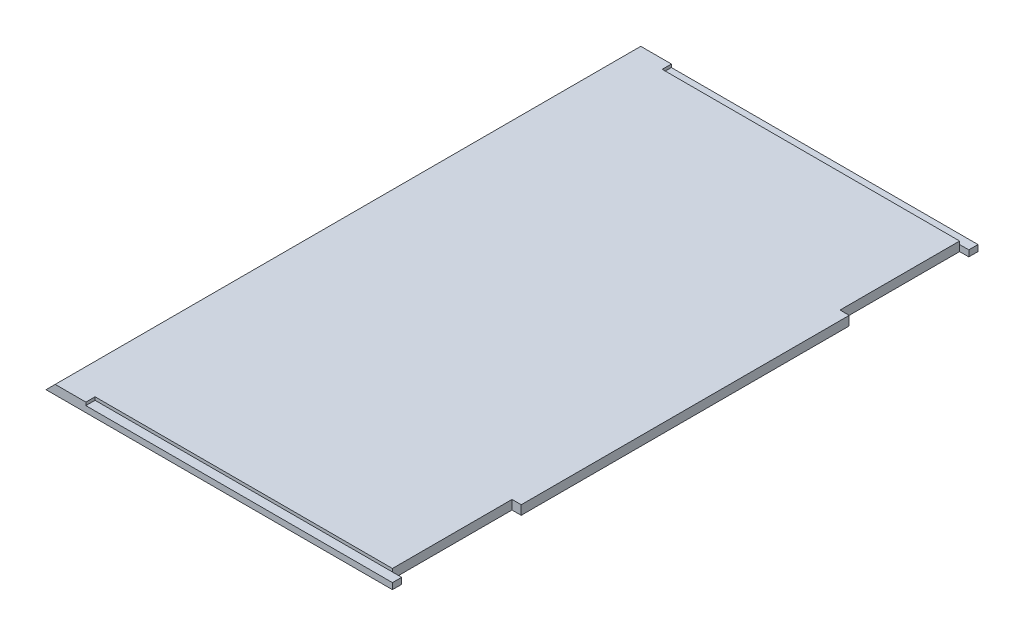
ISO-10303-21;
HEADER;
FILE_DESCRIPTION(('STEP AP214'),'2;1');
FILE_NAME('part.step','',(''),(''),'','','');
FILE_SCHEMA(('AUTOMOTIVE_DESIGN { 1 0 10303 214 1 1 1 1 }'));
ENDSEC;
DATA;
#1=APPLICATION_CONTEXT('core data for automotive mechanical design processes');
#2=APPLICATION_PROTOCOL_DEFINITION('international standard','automotive_design',2000,#1);
#3=PRODUCT_CONTEXT('',#1,'mechanical');
#4=PRODUCT('Part','Part','',(#3));
#5=PRODUCT_RELATED_PRODUCT_CATEGORY('part','',(#4));
#6=PRODUCT_DEFINITION_FORMATION('','',#4);
#7=PRODUCT_DEFINITION_CONTEXT('part definition',#1,'design');
#8=PRODUCT_DEFINITION('design','',#6,#7);
#9=PRODUCT_DEFINITION_SHAPE('','',#8);
#10=(LENGTH_UNIT() NAMED_UNIT(*) SI_UNIT(.MILLI.,.METRE.));
#11=(NAMED_UNIT(*) PLANE_ANGLE_UNIT() SI_UNIT($,.RADIAN.));
#12=(NAMED_UNIT(*) SI_UNIT($,.STERADIAN.) SOLID_ANGLE_UNIT());
#13=UNCERTAINTY_MEASURE_WITH_UNIT(LENGTH_MEASURE(1.E-05),#10,'distance_accuracy_value','');
#14=(GEOMETRIC_REPRESENTATION_CONTEXT(3) GLOBAL_UNCERTAINTY_ASSIGNED_CONTEXT((#13)) GLOBAL_UNIT_ASSIGNED_CONTEXT((#10,
#11,#12)) REPRESENTATION_CONTEXT('',''));
#15=CARTESIAN_POINT('',(0.,0.,0.));
#16=DIRECTION('',(0.,0.,1.));
#17=DIRECTION('',(1.,0.,0.));
#18=AXIS2_PLACEMENT_3D('',#15,#16,#17);
#19=CARTESIAN_POINT('',(75.4824524407195,3.,-10.5327159198509));
#20=DIRECTION('',(-1.,0.,0.));
#21=DIRECTION('',(0.,0.,1.));
#22=AXIS2_PLACEMENT_3D('',#19,#20,#21);
#23=PLANE('',#22);
#24=DIRECTION('',(0.,-1.,0.));
#25=VECTOR('',#24,1.);
#26=CARTESIAN_POINT('',(75.4824524407195,3.,177.467284080149));
#27=LINE('',#26,#25);
#28=CARTESIAN_POINT('',(75.4824524407195,2.,177.467284080149));
#29=VERTEX_POINT('',#28);
#30=CARTESIAN_POINT('',(75.4824524407195,0.,177.467284080149));
#31=VERTEX_POINT('',#30);
#32=EDGE_CURVE('E295',#29,#31,#27,.T.);
#33=ORIENTED_EDGE('',*,*,#32,.F.);
#34=DIRECTION('',(0.,0.,-1.));
#35=VECTOR('',#34,1.);
#36=CARTESIAN_POINT('',(75.4824524407195,2.,177.467284080149));
#37=LINE('',#36,#35);
#38=CARTESIAN_POINT('',(75.4824524407195,2.,180.467284080149));
#39=VERTEX_POINT('',#38);
#40=EDGE_CURVE('E247',#39,#29,#37,.T.);
#41=ORIENTED_EDGE('',*,*,#40,.F.);
#42=DIRECTION('',(0.,-1.,0.));
#43=VECTOR('',#42,1.);
#44=CARTESIAN_POINT('',(75.4824524407195,3.,180.467284080149));
#45=LINE('',#44,#43);
#46=CARTESIAN_POINT('',(75.4824524407195,0.,180.467284080149));
#47=VERTEX_POINT('',#46);
#48=EDGE_CURVE('E213',#39,#47,#45,.T.);
#49=ORIENTED_EDGE('',*,*,#48,.T.);
#50=DIRECTION('',(0.,0.,-1.));
#51=VECTOR('',#50,1.);
#52=CARTESIAN_POINT('',(75.4824524407195,0.,-10.5327159198509));
#53=LINE('',#52,#51);
#54=EDGE_CURVE('E205',#47,#31,#53,.T.);
#55=ORIENTED_EDGE('',*,*,#54,.T.);
#56=EDGE_LOOP('',(#33,#41,#49,#55));
#57=FACE_BOUND('',#56,.T.);
#58=ADVANCED_FACE('F35',(#57),#23,.F.);
#59=DIRECTION('',(0.,-1.,0.));
#60=VECTOR('',#59,1.);
#61=CARTESIAN_POINT('',(75.4824524407195,3.,138.467284080149));
#62=LINE('',#61,#60);
#63=CARTESIAN_POINT('',(75.4824524407195,3.,138.467284080149));
#64=VERTEX_POINT('',#63);
#65=CARTESIAN_POINT('',(75.4824524407195,0.,138.467284080149));
#66=VERTEX_POINT('',#65);
#67=EDGE_CURVE('E297',#64,#66,#62,.T.);
#68=ORIENTED_EDGE('',*,*,#67,.T.);
#69=CARTESIAN_POINT('',(75.4824524407195,0.,31.4672840801491));
#70=VERTEX_POINT('',#69);
#71=EDGE_CURVE('E208',#66,#70,#53,.T.);
#72=ORIENTED_EDGE('',*,*,#71,.T.);
#73=DIRECTION('',(0.,-1.,0.));
#74=VECTOR('',#73,1.);
#75=CARTESIAN_POINT('',(75.4824524407195,3.,31.4672840801491));
#76=LINE('',#75,#74);
#77=CARTESIAN_POINT('',(75.4824524407195,3.,31.4672840801491));
#78=VERTEX_POINT('',#77);
#79=EDGE_CURVE('E260',#78,#70,#76,.T.);
#80=ORIENTED_EDGE('',*,*,#79,.F.);
#81=DIRECTION('',(0.,0.,-1.));
#82=VECTOR('',#81,1.);
#83=CARTESIAN_POINT('',(75.4824524407195,3.,-10.5327159198509));
#84=LINE('',#83,#82);
#85=EDGE_CURVE('E196',#64,#78,#84,.T.);
#86=ORIENTED_EDGE('',*,*,#85,.F.);
#87=EDGE_LOOP('',(#68,#72,#80,#86));
#88=FACE_BOUND('',#87,.T.);
#89=ADVANCED_FACE('F314',(#88),#23,.F.);
#90=CARTESIAN_POINT('',(0.,3.,0.));
#91=DIRECTION('',(0.,1.,0.));
#92=DIRECTION('',(0.,0.,1.));
#93=AXIS2_PLACEMENT_3D('',#90,#91,#92);
#94=PLANE('',#93);
#95=DIRECTION('',(-1.,0.,0.));
#96=VECTOR('',#95,1.);
#97=CARTESIAN_POINT('',(-24.5175475592805,3.,177.467284080149));
#98=LINE('',#97,#96);
#99=CARTESIAN_POINT('',(72.4824524407195,3.,177.467284080149));
#100=VERTEX_POINT('',#99);
#101=CARTESIAN_POINT('',(-24.5175475592805,3.,177.467284080149));
#102=VERTEX_POINT('',#101);
#103=EDGE_CURVE('E167',#100,#102,#98,.T.);
#104=ORIENTED_EDGE('',*,*,#103,.F.);
#105=DIRECTION('',(0.,0.,1.));
#106=VECTOR('',#105,1.);
#107=CARTESIAN_POINT('',(72.4824524407195,3.,177.467284080149));
#108=LINE('',#107,#106);
#109=CARTESIAN_POINT('',(72.4824524407195,3.,138.467284080149));
#110=VERTEX_POINT('',#109);
#111=EDGE_CURVE('E153',#110,#100,#108,.T.);
#112=ORIENTED_EDGE('',*,*,#111,.F.);
#113=DIRECTION('',(-1.,0.,0.));
#114=VECTOR('',#113,1.);
#115=CARTESIAN_POINT('',(72.4824524407195,3.,138.467284080149));
#116=LINE('',#115,#114);
#117=EDGE_CURVE('E160',#64,#110,#116,.T.);
#118=ORIENTED_EDGE('',*,*,#117,.F.);
#119=ORIENTED_EDGE('',*,*,#85,.T.);
#120=DIRECTION('',(1.,0.,0.));
#121=VECTOR('',#120,1.);
#122=CARTESIAN_POINT('',(72.4824524407195,3.,31.4672840801491));
#123=LINE('',#122,#121);
#124=CARTESIAN_POINT('',(72.4824524407195,3.,31.4672840801491));
#125=VERTEX_POINT('',#124);
#126=EDGE_CURVE('E291',#125,#78,#123,.T.);
#127=ORIENTED_EDGE('',*,*,#126,.F.);
#128=DIRECTION('',(0.,0.,1.));
#129=VECTOR('',#128,1.);
#130=CARTESIAN_POINT('',(72.4824524407195,3.,-7.53271591985094));
#131=LINE('',#130,#129);
#132=CARTESIAN_POINT('',(72.4824524407195,3.,-7.53271591985094));
#133=VERTEX_POINT('',#132);
#134=EDGE_CURVE('E285',#133,#125,#131,.T.);
#135=ORIENTED_EDGE('',*,*,#134,.F.);
#136=DIRECTION('',(1.,0.,0.));
#137=VECTOR('',#136,1.);
#138=CARTESIAN_POINT('',(-24.5175475592805,3.,-7.53271591985094));
#139=LINE('',#138,#137);
#140=CARTESIAN_POINT('',(-24.5175475592805,3.,-7.53271591985094));
#141=VERTEX_POINT('',#140);
#142=EDGE_CURVE('E255',#141,#133,#139,.T.);
#143=ORIENTED_EDGE('',*,*,#142,.F.);
#144=DIRECTION('',(0.,0.,1.));
#145=VECTOR('',#144,1.);
#146=CARTESIAN_POINT('',(-24.5175475592805,3.,-10.5327159198509));
#147=LINE('',#146,#145);
#148=CARTESIAN_POINT('',(-24.5175475592805,3.,-10.5327159198509));
#149=VERTEX_POINT('',#148);
#150=EDGE_CURVE('E58',#149,#141,#147,.T.);
#151=ORIENTED_EDGE('',*,*,#150,.F.);
#152=DIRECTION('',(-1.,0.,0.));
#153=VECTOR('',#152,1.);
#154=CARTESIAN_POINT('',(-44.5175475592805,3.,-10.5327159198509));
#155=LINE('',#154,#153);
#156=CARTESIAN_POINT('',(-34.5175475592803,3.,-10.5327159198509));
#157=VERTEX_POINT('',#156);
#158=EDGE_CURVE('E199',#149,#157,#155,.T.);
#159=ORIENTED_EDGE('',*,*,#158,.T.);
#160=DIRECTION('',(0.,0.,1.));
#161=VECTOR('',#160,1.);
#162=CARTESIAN_POINT('',(-34.5175475592803,3.,180.467284080149));
#163=LINE('',#162,#161);
#164=CARTESIAN_POINT('',(-34.5175475592803,3.,180.467284080149));
#165=VERTEX_POINT('',#164);
#166=EDGE_CURVE('E215',#157,#165,#163,.T.);
#167=ORIENTED_EDGE('',*,*,#166,.T.);
#168=DIRECTION('',(1.,0.,0.));
#169=VECTOR('',#168,1.);
#170=CARTESIAN_POINT('',(-44.5175475592805,3.,180.467284080149));
#171=LINE('',#170,#169);
#172=CARTESIAN_POINT('',(-24.5175475592805,3.,180.467284080149));
#173=VERTEX_POINT('',#172);
#174=EDGE_CURVE('E194',#165,#173,#171,.T.);
#175=ORIENTED_EDGE('',*,*,#174,.T.);
#176=DIRECTION('',(0.,0.,1.));
#177=VECTOR('',#176,1.);
#178=CARTESIAN_POINT('',(-24.5175475592805,3.,177.467284080149));
#179=LINE('',#178,#177);
#180=EDGE_CURVE('E177',#102,#173,#179,.T.);
#181=ORIENTED_EDGE('',*,*,#180,.F.);
#182=EDGE_LOOP('',(#104,#112,#118,#119,#127,#135,#143,#151,#159,#167,#175,#181));
#183=FACE_BOUND('',#182,.T.);
#184=ADVANCED_FACE('F175',(#183),#94,.T.);
#185=CARTESIAN_POINT('',(0.,0.,0.));
#186=DIRECTION('',(0.,1.,0.));
#187=DIRECTION('',(0.,0.,1.));
#188=AXIS2_PLACEMENT_3D('',#185,#186,#187);
#189=PLANE('',#188);
#190=DIRECTION('',(1.,0.,0.));
#191=VECTOR('',#190,1.);
#192=CARTESIAN_POINT('',(72.4824524407195,0.,177.467284080149));
#193=LINE('',#192,#191);
#194=CARTESIAN_POINT('',(72.4824524407195,0.,177.467284080149));
#195=VERTEX_POINT('',#194);
#196=EDGE_CURVE('E303',#195,#31,#193,.T.);
#197=ORIENTED_EDGE('',*,*,#196,.T.);
#198=ORIENTED_EDGE('',*,*,#54,.F.);
#199=DIRECTION('',(1.,0.,0.));
#200=VECTOR('',#199,1.);
#201=CARTESIAN_POINT('',(-44.5175475592805,0.,180.467284080149));
#202=LINE('',#201,#200);
#203=CARTESIAN_POINT('',(-37.5175475592804,0.,180.467284080149));
#204=VERTEX_POINT('',#203);
#205=EDGE_CURVE('E189',#204,#47,#202,.T.);
#206=ORIENTED_EDGE('',*,*,#205,.F.);
#207=DIRECTION('',(0.,0.,-1.));
#208=VECTOR('',#207,1.);
#209=CARTESIAN_POINT('',(-37.5175475592804,0.,0.));
#210=LINE('',#209,#208);
#211=CARTESIAN_POINT('',(-37.5175475592804,0.,-10.5327159198509));
#212=VERTEX_POINT('',#211);
#213=EDGE_CURVE('E43',#204,#212,#210,.T.);
#214=ORIENTED_EDGE('',*,*,#213,.T.);
#215=DIRECTION('',(-1.,0.,0.));
#216=VECTOR('',#215,1.);
#217=CARTESIAN_POINT('',(-44.5175475592805,0.,-10.5327159198509));
#218=LINE('',#217,#216);
#219=CARTESIAN_POINT('',(75.4824524407195,0.,-10.5327159198509));
#220=VERTEX_POINT('',#219);
#221=EDGE_CURVE('E197',#220,#212,#218,.T.);
#222=ORIENTED_EDGE('',*,*,#221,.F.);
#223=CARTESIAN_POINT('',(75.4824524407195,0.,-7.53271591985094));
#224=VERTEX_POINT('',#223);
#225=EDGE_CURVE('E204',#224,#220,#53,.T.);
#226=ORIENTED_EDGE('',*,*,#225,.F.);
#227=DIRECTION('',(-1.,0.,0.));
#228=VECTOR('',#227,1.);
#229=CARTESIAN_POINT('',(72.4824524407195,0.,-7.53271591985094));
#230=LINE('',#229,#228);
#231=CARTESIAN_POINT('',(72.4824524407195,0.,-7.53271591985094));
#232=VERTEX_POINT('',#231);
#233=EDGE_CURVE('E282',#224,#232,#230,.T.);
#234=ORIENTED_EDGE('',*,*,#233,.T.);
#235=DIRECTION('',(0.,0.,1.));
#236=VECTOR('',#235,1.);
#237=CARTESIAN_POINT('',(72.4824524407195,0.,-7.53271591985094));
#238=LINE('',#237,#236);
#239=CARTESIAN_POINT('',(72.4824524407195,0.,31.4672840801491));
#240=VERTEX_POINT('',#239);
#241=EDGE_CURVE('E171',#232,#240,#238,.T.);
#242=ORIENTED_EDGE('',*,*,#241,.T.);
#243=DIRECTION('',(1.,0.,0.));
#244=VECTOR('',#243,1.);
#245=CARTESIAN_POINT('',(72.4824524407195,0.,31.4672840801491));
#246=LINE('',#245,#244);
#247=EDGE_CURVE('E286',#240,#70,#246,.T.);
#248=ORIENTED_EDGE('',*,*,#247,.T.);
#249=ORIENTED_EDGE('',*,*,#71,.F.);
#250=DIRECTION('',(-1.,0.,0.));
#251=VECTOR('',#250,1.);
#252=CARTESIAN_POINT('',(72.4824524407195,0.,138.467284080149));
#253=LINE('',#252,#251);
#254=CARTESIAN_POINT('',(72.4824524407195,0.,138.467284080149));
#255=VERTEX_POINT('',#254);
#256=EDGE_CURVE('E161',#66,#255,#253,.T.);
#257=ORIENTED_EDGE('',*,*,#256,.T.);
#258=DIRECTION('',(0.,0.,1.));
#259=VECTOR('',#258,1.);
#260=CARTESIAN_POINT('',(72.4824524407195,0.,177.467284080149));
#261=LINE('',#260,#259);
#262=EDGE_CURVE('E305',#255,#195,#261,.T.);
#263=ORIENTED_EDGE('',*,*,#262,.T.);
#264=EDGE_LOOP('',(#197,#198,#206,#214,#222,#226,#234,#242,#248,#249,#257,#263));
#265=FACE_BOUND('',#264,.T.);
#266=ADVANCED_FACE('F224',(#265),#189,.F.);
#267=CARTESIAN_POINT('',(-24.5175475592805,2.,177.467284080149));
#268=DIRECTION('',(0.,0.,-1.));
#269=DIRECTION('',(-1.,0.,0.));
#270=AXIS2_PLACEMENT_3D('',#267,#268,#269);
#271=PLANE('',#270);
#272=DIRECTION('',(0.,-1.,0.));
#273=VECTOR('',#272,1.);
#274=CARTESIAN_POINT('',(72.4824524407195,3.,177.467284080149));
#275=LINE('',#274,#273);
#276=CARTESIAN_POINT('',(72.4824524407195,2.,177.467284080149));
#277=VERTEX_POINT('',#276);
#278=EDGE_CURVE('E50',#100,#277,#275,.T.);
#279=ORIENTED_EDGE('',*,*,#278,.F.);
#280=ORIENTED_EDGE('',*,*,#103,.T.);
#281=DIRECTION('',(0.,1.,0.));
#282=VECTOR('',#281,1.);
#283=CARTESIAN_POINT('',(-24.5175475592805,2.,177.467284080149));
#284=LINE('',#283,#282);
#285=CARTESIAN_POINT('',(-24.5175475592805,2.,177.467284080149));
#286=VERTEX_POINT('',#285);
#287=EDGE_CURVE('E187',#286,#102,#284,.T.);
#288=ORIENTED_EDGE('',*,*,#287,.F.);
#289=DIRECTION('',(-1.,0.,0.));
#290=VECTOR('',#289,1.);
#291=CARTESIAN_POINT('',(-24.5175475592805,2.,177.467284080149));
#292=LINE('',#291,#290);
#293=EDGE_CURVE('E169',#277,#286,#292,.T.);
#294=ORIENTED_EDGE('',*,*,#293,.F.);
#295=EDGE_LOOP('',(#279,#280,#288,#294));
#296=FACE_BOUND('',#295,.T.);
#297=ADVANCED_FACE('F165',(#296),#271,.F.);
#298=DIRECTION('',(0.,1.,0.));
#299=VECTOR('',#298,1.);
#300=CARTESIAN_POINT('',(75.4824524407195,3.,-7.53271591985094));
#301=LINE('',#300,#299);
#302=CARTESIAN_POINT('',(75.4824524407195,2.,-7.53271591985094));
#303=VERTEX_POINT('',#302);
#304=EDGE_CURVE('E273',#224,#303,#301,.T.);
#305=ORIENTED_EDGE('',*,*,#304,.F.);
#306=ORIENTED_EDGE('',*,*,#225,.T.);
#307=DIRECTION('',(0.,-1.,0.));
#308=VECTOR('',#307,1.);
#309=CARTESIAN_POINT('',(75.4824524407195,3.,-10.5327159198509));
#310=LINE('',#309,#308);
#311=CARTESIAN_POINT('',(75.4824524407195,2.,-10.5327159198509));
#312=VERTEX_POINT('',#311);
#313=EDGE_CURVE('E201',#312,#220,#310,.T.);
#314=ORIENTED_EDGE('',*,*,#313,.F.);
#315=DIRECTION('',(0.,0.,-1.));
#316=VECTOR('',#315,1.);
#317=CARTESIAN_POINT('',(75.4824524407195,2.,-10.5327159198509));
#318=LINE('',#317,#316);
#319=EDGE_CURVE('E263',#303,#312,#318,.T.);
#320=ORIENTED_EDGE('',*,*,#319,.F.);
#321=EDGE_LOOP('',(#305,#306,#314,#320));
#322=FACE_BOUND('',#321,.T.);
#323=ADVANCED_FACE('F336',(#322),#23,.F.);
#324=CARTESIAN_POINT('',(-24.5175475592805,2.,-7.53271591985094));
#325=DIRECTION('',(0.,0.,1.));
#326=DIRECTION('',(1.,0.,0.));
#327=AXIS2_PLACEMENT_3D('',#324,#325,#326);
#328=PLANE('',#327);
#329=DIRECTION('',(0.,-1.,0.));
#330=VECTOR('',#329,1.);
#331=CARTESIAN_POINT('',(72.4824524407195,3.,-7.53271591985094));
#332=LINE('',#331,#330);
#333=CARTESIAN_POINT('',(72.4824524407195,2.,-7.53271591985094));
#334=VERTEX_POINT('',#333);
#335=EDGE_CURVE('E278',#133,#334,#332,.T.);
#336=ORIENTED_EDGE('',*,*,#335,.T.);
#337=DIRECTION('',(1.,0.,0.));
#338=VECTOR('',#337,1.);
#339=CARTESIAN_POINT('',(-24.5175475592805,2.,-7.53271591985094));
#340=LINE('',#339,#338);
#341=CARTESIAN_POINT('',(-24.5175475592805,2.,-7.53271591985094));
#342=VERTEX_POINT('',#341);
#343=EDGE_CURVE('E265',#342,#334,#340,.T.);
#344=ORIENTED_EDGE('',*,*,#343,.F.);
#345=DIRECTION('',(0.,1.,0.));
#346=VECTOR('',#345,1.);
#347=CARTESIAN_POINT('',(-24.5175475592805,2.,-7.53271591985094));
#348=LINE('',#347,#346);
#349=EDGE_CURVE('E251',#342,#141,#348,.T.);
#350=ORIENTED_EDGE('',*,*,#349,.T.);
#351=ORIENTED_EDGE('',*,*,#142,.T.);
#352=EDGE_LOOP('',(#336,#344,#350,#351));
#353=FACE_BOUND('',#352,.T.);
#354=ADVANCED_FACE('F326',(#353),#328,.F.);
#355=CARTESIAN_POINT('',(-44.5175475592805,3.,180.467284080149));
#356=DIRECTION('',(0.,0.,-1.));
#357=DIRECTION('',(-1.,0.,0.));
#358=AXIS2_PLACEMENT_3D('',#355,#356,#357);
#359=PLANE('',#358);
#360=DIRECTION('',(1.,0.,0.));
#361=VECTOR('',#360,1.);
#362=CARTESIAN_POINT('',(-24.5175475592805,2.,180.467284080149));
#363=LINE('',#362,#361);
#364=CARTESIAN_POINT('',(-24.5175475592805,2.,180.467284080149));
#365=VERTEX_POINT('',#364);
#366=EDGE_CURVE('E181',#365,#39,#363,.T.);
#367=ORIENTED_EDGE('',*,*,#366,.F.);
#368=DIRECTION('',(0.,1.,0.));
#369=VECTOR('',#368,1.);
#370=CARTESIAN_POINT('',(-24.5175475592805,2.,180.467284080149));
#371=LINE('',#370,#369);
#372=EDGE_CURVE('E190',#365,#173,#371,.T.);
#373=ORIENTED_EDGE('',*,*,#372,.T.);
#374=ORIENTED_EDGE('',*,*,#174,.F.);
#375=DIRECTION('',(-0.707106781186551,-0.707106781186544,0.));
#376=VECTOR('',#375,1.);
#377=CARTESIAN_POINT('',(-34.5175475592803,2.99999999999999,180.467284080149));
#378=LINE('',#377,#376);
#379=EDGE_CURVE('E218',#165,#204,#378,.T.);
#380=ORIENTED_EDGE('',*,*,#379,.T.);
#381=ORIENTED_EDGE('',*,*,#205,.T.);
#382=ORIENTED_EDGE('',*,*,#48,.F.);
#383=EDGE_LOOP('',(#367,#373,#374,#380,#381,#382));
#384=FACE_BOUND('',#383,.T.);
#385=ADVANCED_FACE('F238',(#384),#359,.F.);
#386=CARTESIAN_POINT('',(-44.5175475592805,3.,-10.5327159198509));
#387=DIRECTION('',(0.,0.,1.));
#388=DIRECTION('',(1.,0.,0.));
#389=AXIS2_PLACEMENT_3D('',#386,#387,#388);
#390=PLANE('',#389);
#391=ORIENTED_EDGE('',*,*,#158,.F.);
#392=DIRECTION('',(0.,1.,0.));
#393=VECTOR('',#392,1.);
#394=CARTESIAN_POINT('',(-24.5175475592805,2.,-10.5327159198509));
#395=LINE('',#394,#393);
#396=CARTESIAN_POINT('',(-24.5175475592805,2.,-10.5327159198509));
#397=VERTEX_POINT('',#396);
#398=EDGE_CURVE('E183',#397,#149,#395,.T.);
#399=ORIENTED_EDGE('',*,*,#398,.F.);
#400=DIRECTION('',(-1.,0.,0.));
#401=VECTOR('',#400,1.);
#402=CARTESIAN_POINT('',(-24.5175475592805,2.,-10.5327159198509));
#403=LINE('',#402,#401);
#404=EDGE_CURVE('E253',#312,#397,#403,.T.);
#405=ORIENTED_EDGE('',*,*,#404,.F.);
#406=ORIENTED_EDGE('',*,*,#313,.T.);
#407=ORIENTED_EDGE('',*,*,#221,.T.);
#408=DIRECTION('',(0.707106781186551,0.707106781186544,0.));
#409=VECTOR('',#408,1.);
#410=CARTESIAN_POINT('',(-34.5175475592803,3.,-10.5327159198509));
#411=LINE('',#410,#409);
#412=EDGE_CURVE('E11',#212,#157,#411,.T.);
#413=ORIENTED_EDGE('',*,*,#412,.T.);
#414=EDGE_LOOP('',(#391,#399,#405,#406,#407,#413));
#415=FACE_BOUND('',#414,.T.);
#416=ADVANCED_FACE('F231',(#415),#390,.F.);
#417=CARTESIAN_POINT('',(-34.5175475592803,3.,0.));
#418=DIRECTION('',(-0.707106781186544,0.707106781186551,0.));
#419=DIRECTION('',(0.,0.,-1.));
#420=AXIS2_PLACEMENT_3D('',#417,#418,#419);
#421=PLANE('',#420);
#422=ORIENTED_EDGE('',*,*,#412,.F.);
#423=ORIENTED_EDGE('',*,*,#213,.F.);
#424=ORIENTED_EDGE('',*,*,#379,.F.);
#425=ORIENTED_EDGE('',*,*,#166,.F.);
#426=EDGE_LOOP('',(#422,#423,#424,#425));
#427=FACE_BOUND('',#426,.T.);
#428=ADVANCED_FACE('F37',(#427),#421,.T.);
#429=CARTESIAN_POINT('',(-24.5175475592805,2.,177.467284080149));
#430=DIRECTION('',(-1.,0.,0.));
#431=DIRECTION('',(0.,0.,1.));
#432=AXIS2_PLACEMENT_3D('',#429,#430,#431);
#433=PLANE('',#432);
#434=ORIENTED_EDGE('',*,*,#180,.T.);
#435=ORIENTED_EDGE('',*,*,#372,.F.);
#436=DIRECTION('',(0.,0.,1.));
#437=VECTOR('',#436,1.);
#438=CARTESIAN_POINT('',(-24.5175475592805,2.,177.467284080149));
#439=LINE('',#438,#437);
#440=EDGE_CURVE('E178',#286,#365,#439,.T.);
#441=ORIENTED_EDGE('',*,*,#440,.F.);
#442=ORIENTED_EDGE('',*,*,#287,.T.);
#443=EDGE_LOOP('',(#434,#435,#441,#442));
#444=FACE_BOUND('',#443,.T.);
#445=ADVANCED_FACE('F242',(#444),#433,.F.);
#446=CARTESIAN_POINT('',(0.,2.,0.));
#447=DIRECTION('',(0.,1.,0.));
#448=DIRECTION('',(0.,0.,1.));
#449=AXIS2_PLACEMENT_3D('',#446,#447,#448);
#450=PLANE('',#449);
#451=ORIENTED_EDGE('',*,*,#440,.T.);
#452=ORIENTED_EDGE('',*,*,#366,.T.);
#453=ORIENTED_EDGE('',*,*,#40,.T.);
#454=EDGE_CURVE('E193',#29,#277,#292,.T.);
#455=ORIENTED_EDGE('',*,*,#454,.T.);
#456=ORIENTED_EDGE('',*,*,#293,.T.);
#457=EDGE_LOOP('',(#451,#452,#453,#455,#456));
#458=FACE_BOUND('',#457,.T.);
#459=ADVANCED_FACE('F244',(#458),#450,.T.);
#460=CARTESIAN_POINT('',(-24.5175475592805,2.,-10.5327159198509));
#461=DIRECTION('',(-1.,0.,0.));
#462=DIRECTION('',(0.,0.,1.));
#463=AXIS2_PLACEMENT_3D('',#460,#461,#462);
#464=PLANE('',#463);
#465=ORIENTED_EDGE('',*,*,#150,.T.);
#466=ORIENTED_EDGE('',*,*,#349,.F.);
#467=DIRECTION('',(0.,0.,1.));
#468=VECTOR('',#467,1.);
#469=CARTESIAN_POINT('',(-24.5175475592805,2.,-10.5327159198509));
#470=LINE('',#469,#468);
#471=EDGE_CURVE('E258',#397,#342,#470,.T.);
#472=ORIENTED_EDGE('',*,*,#471,.F.);
#473=ORIENTED_EDGE('',*,*,#398,.T.);
#474=EDGE_LOOP('',(#465,#466,#472,#473));
#475=FACE_BOUND('',#474,.T.);
#476=ADVANCED_FACE('F328',(#475),#464,.F.);
#477=CARTESIAN_POINT('',(0.,2.,0.));
#478=DIRECTION('',(0.,1.,0.));
#479=DIRECTION('',(0.,0.,1.));
#480=AXIS2_PLACEMENT_3D('',#477,#478,#479);
#481=PLANE('',#480);
#482=ORIENTED_EDGE('',*,*,#471,.T.);
#483=ORIENTED_EDGE('',*,*,#343,.T.);
#484=EDGE_CURVE('E268',#334,#303,#340,.T.);
#485=ORIENTED_EDGE('',*,*,#484,.T.);
#486=ORIENTED_EDGE('',*,*,#319,.T.);
#487=ORIENTED_EDGE('',*,*,#404,.T.);
#488=EDGE_LOOP('',(#482,#483,#485,#486,#487));
#489=FACE_BOUND('',#488,.T.);
#490=ADVANCED_FACE('F331',(#489),#481,.T.);
#491=CARTESIAN_POINT('',(72.4824524407195,3.,31.4672840801491));
#492=DIRECTION('',(0.,0.,-1.));
#493=DIRECTION('',(-1.,0.,0.));
#494=AXIS2_PLACEMENT_3D('',#491,#492,#493);
#495=PLANE('',#494);
#496=ORIENTED_EDGE('',*,*,#79,.T.);
#497=ORIENTED_EDGE('',*,*,#247,.F.);
#498=DIRECTION('',(0.,-1.,0.));
#499=VECTOR('',#498,1.);
#500=CARTESIAN_POINT('',(72.4824524407195,3.,31.4672840801491));
#501=LINE('',#500,#499);
#502=EDGE_CURVE('E275',#125,#240,#501,.T.);
#503=ORIENTED_EDGE('',*,*,#502,.F.);
#504=ORIENTED_EDGE('',*,*,#126,.T.);
#505=EDGE_LOOP('',(#496,#497,#503,#504));
#506=FACE_BOUND('',#505,.T.);
#507=ADVANCED_FACE('F317',(#506),#495,.T.);
#508=CARTESIAN_POINT('',(72.4824524407195,3.,-7.53271591985094));
#509=DIRECTION('',(0.,0.,1.));
#510=DIRECTION('',(1.,0.,0.));
#511=AXIS2_PLACEMENT_3D('',#508,#509,#510);
#512=PLANE('',#511);
#513=ORIENTED_EDGE('',*,*,#304,.T.);
#514=ORIENTED_EDGE('',*,*,#484,.F.);
#515=EDGE_CURVE('E281',#334,#232,#332,.T.);
#516=ORIENTED_EDGE('',*,*,#515,.T.);
#517=ORIENTED_EDGE('',*,*,#233,.F.);
#518=EDGE_LOOP('',(#513,#514,#516,#517));
#519=FACE_BOUND('',#518,.T.);
#520=ADVANCED_FACE('F338',(#519),#512,.T.);
#521=CARTESIAN_POINT('',(72.4824524407195,3.,-7.53271591985094));
#522=DIRECTION('',(1.,0.,0.));
#523=DIRECTION('',(0.,0.,-1.));
#524=AXIS2_PLACEMENT_3D('',#521,#522,#523);
#525=PLANE('',#524);
#526=ORIENTED_EDGE('',*,*,#241,.F.);
#527=ORIENTED_EDGE('',*,*,#515,.F.);
#528=ORIENTED_EDGE('',*,*,#335,.F.);
#529=ORIENTED_EDGE('',*,*,#134,.T.);
#530=ORIENTED_EDGE('',*,*,#502,.T.);
#531=EDGE_LOOP('',(#526,#527,#528,#529,#530));
#532=FACE_BOUND('',#531,.T.);
#533=ADVANCED_FACE('F322',(#532),#525,.T.);
#534=CARTESIAN_POINT('',(72.4824524407195,3.,177.467284080149));
#535=DIRECTION('',(1.,0.,0.));
#536=DIRECTION('',(0.,0.,-1.));
#537=AXIS2_PLACEMENT_3D('',#534,#535,#536);
#538=PLANE('',#537);
#539=ORIENTED_EDGE('',*,*,#262,.F.);
#540=DIRECTION('',(0.,-1.,0.));
#541=VECTOR('',#540,1.);
#542=CARTESIAN_POINT('',(72.4824524407195,3.,138.467284080149));
#543=LINE('',#542,#541);
#544=EDGE_CURVE('E156',#110,#255,#543,.T.);
#545=ORIENTED_EDGE('',*,*,#544,.F.);
#546=ORIENTED_EDGE('',*,*,#111,.T.);
#547=ORIENTED_EDGE('',*,*,#278,.T.);
#548=EDGE_CURVE('E172',#277,#195,#275,.T.);
#549=ORIENTED_EDGE('',*,*,#548,.T.);
#550=EDGE_LOOP('',(#539,#545,#546,#547,#549));
#551=FACE_BOUND('',#550,.T.);
#552=ADVANCED_FACE('F155',(#551),#538,.T.);
#553=CARTESIAN_POINT('',(72.4824524407195,3.,177.467284080149));
#554=DIRECTION('',(0.,0.,-1.));
#555=DIRECTION('',(-1.,0.,0.));
#556=AXIS2_PLACEMENT_3D('',#553,#554,#555);
#557=PLANE('',#556);
#558=ORIENTED_EDGE('',*,*,#32,.T.);
#559=ORIENTED_EDGE('',*,*,#196,.F.);
#560=ORIENTED_EDGE('',*,*,#548,.F.);
#561=ORIENTED_EDGE('',*,*,#454,.F.);
#562=EDGE_LOOP('',(#558,#559,#560,#561));
#563=FACE_BOUND('',#562,.T.);
#564=ADVANCED_FACE('F457',(#563),#557,.T.);
#565=CARTESIAN_POINT('',(72.4824524407195,3.,138.467284080149));
#566=DIRECTION('',(0.,0.,1.));
#567=DIRECTION('',(1.,0.,0.));
#568=AXIS2_PLACEMENT_3D('',#565,#566,#567);
#569=PLANE('',#568);
#570=ORIENTED_EDGE('',*,*,#256,.F.);
#571=ORIENTED_EDGE('',*,*,#67,.F.);
#572=ORIENTED_EDGE('',*,*,#117,.T.);
#573=ORIENTED_EDGE('',*,*,#544,.T.);
#574=EDGE_LOOP('',(#570,#571,#572,#573));
#575=FACE_BOUND('',#574,.T.);
#576=ADVANCED_FACE('F309',(#575),#569,.T.);
#577=CLOSED_SHELL('',(#58,#89,#184,#266,#297,#323,#354,#385,#416,#428,#445,#459,#476,#490,#507,
#520,#533,#552,#564,#576));
#578=MANIFOLD_SOLID_BREP('B2',#577);
#579=ADVANCED_BREP_SHAPE_REPRESENTATION('',(#18,#578),#14);
#580=SHAPE_DEFINITION_REPRESENTATION(#9,#579);
ENDSEC;
END-ISO-10303-21;
